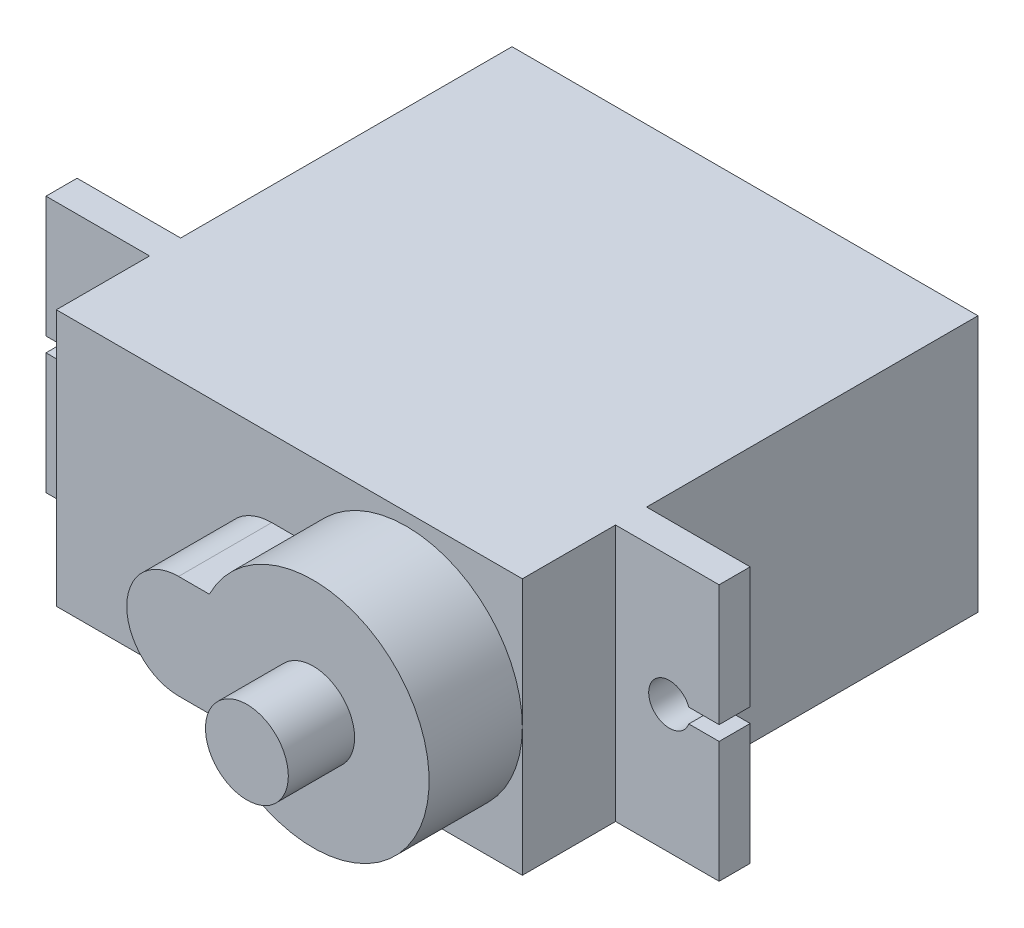
ISO-10303-21;
HEADER;
FILE_DESCRIPTION(('STEP AP214'),'2;1');
FILE_NAME('part.step','',(''),(''),'','','');
FILE_SCHEMA(('AUTOMOTIVE_DESIGN { 1 0 10303 214 1 1 1 1 }'));
ENDSEC;
DATA;
#1=APPLICATION_CONTEXT('core data for automotive mechanical design processes');
#2=APPLICATION_PROTOCOL_DEFINITION('international standard','automotive_design',2000,#1);
#3=PRODUCT_CONTEXT('',#1,'mechanical');
#4=PRODUCT('Part','Part','',(#3));
#5=PRODUCT_RELATED_PRODUCT_CATEGORY('part','',(#4));
#6=PRODUCT_DEFINITION_FORMATION('','',#4);
#7=PRODUCT_DEFINITION_CONTEXT('part definition',#1,'design');
#8=PRODUCT_DEFINITION('design','',#6,#7);
#9=PRODUCT_DEFINITION_SHAPE('','',#8);
#10=(LENGTH_UNIT() NAMED_UNIT(*) SI_UNIT(.MILLI.,.METRE.));
#11=(NAMED_UNIT(*) PLANE_ANGLE_UNIT() SI_UNIT($,.RADIAN.));
#12=(NAMED_UNIT(*) SI_UNIT($,.STERADIAN.) SOLID_ANGLE_UNIT());
#13=UNCERTAINTY_MEASURE_WITH_UNIT(LENGTH_MEASURE(1.E-05),#10,'distance_accuracy_value','');
#14=(GEOMETRIC_REPRESENTATION_CONTEXT(3) GLOBAL_UNCERTAINTY_ASSIGNED_CONTEXT((#13)) GLOBAL_UNIT_ASSIGNED_CONTEXT((#10,
#11,#12)) REPRESENTATION_CONTEXT('',''));
#15=CARTESIAN_POINT('',(0.,0.,0.));
#16=DIRECTION('',(0.,0.,1.));
#17=DIRECTION('',(1.,0.,0.));
#18=AXIS2_PLACEMENT_3D('',#15,#16,#17);
#19=CARTESIAN_POINT('',(-36.6554904609918,23.4734122395534,29.7));
#20=DIRECTION('',(0.,0.,1.));
#21=DIRECTION('',(1.,0.,0.));
#22=AXIS2_PLACEMENT_3D('',#19,#20,#21);
#23=PLANE('',#22);
#24=CARTESIAN_POINT('',(-34.9554904609918,23.4734122395534,29.7));
#25=DIRECTION('',(0.,0.,1.));
#26=DIRECTION('',(1.,0.,0.));
#27=AXIS2_PLACEMENT_3D('',#24,#25,#26);
#28=CIRCLE('',#27,2.);
#29=CARTESIAN_POINT('',(-32.9554904609918,23.4734122395534,29.7));
#30=VERTEX_POINT('',#29);
#31=EDGE_CURVE('E11',#30,#30,#28,.T.);
#32=ORIENTED_EDGE('',*,*,#31,.T.);
#33=EDGE_LOOP('',(#32));
#34=FACE_BOUND('',#33,.T.);
#35=ADVANCED_FACE('F17',(#34),#23,.T.);
#36=CARTESIAN_POINT('',(-34.9554904609918,23.4734122395534,29.7));
#37=DIRECTION('',(0.,0.,-1.));
#38=DIRECTION('',(-1.,0.,0.));
#39=AXIS2_PLACEMENT_3D('',#36,#37,#38);
#40=CYLINDRICAL_SURFACE('',#39,2.);
#41=CARTESIAN_POINT('',(-34.9554904609918,23.4734122395534,26.5));
#42=DIRECTION('',(0.,0.,1.));
#43=DIRECTION('',(1.,0.,0.));
#44=AXIS2_PLACEMENT_3D('',#41,#42,#43);
#45=CIRCLE('',#44,2.);
#46=CARTESIAN_POINT('',(-32.9554904609918,23.4734122395534,26.5));
#47=VERTEX_POINT('',#46);
#48=EDGE_CURVE('E28',#47,#47,#45,.T.);
#49=ORIENTED_EDGE('',*,*,#48,.T.);
#50=EDGE_LOOP('',(#49));
#51=FACE_BOUND('',#50,.T.);
#52=ORIENTED_EDGE('',*,*,#31,.F.);
#53=EDGE_LOOP('',(#52));
#54=FACE_BOUND('',#53,.T.);
#55=ADVANCED_FACE('F624',(#51,#54),#40,.T.);
#56=CARTESIAN_POINT('',(-40.6054904609918,23.4734122395534,26.5));
#57=DIRECTION('',(0.,0.,1.));
#58=DIRECTION('',(1.,0.,0.));
#59=AXIS2_PLACEMENT_3D('',#56,#57,#58);
#60=PLANE('',#59);
#61=DIRECTION('',(1.,0.,0.));
#62=VECTOR('',#61,1.);
#63=CARTESIAN_POINT('',(-40.7109844242653,25.9734122395534,26.5));
#64=LINE('',#63,#62);
#65=CARTESIAN_POINT('',(-41.4554904609919,25.9734122395534,26.5));
#66=VERTEX_POINT('',#65);
#67=CARTESIAN_POINT('',(-39.9664783875389,25.9734122395534,26.5));
#68=VERTEX_POINT('',#67);
#69=EDGE_CURVE('E455',#66,#68,#64,.T.);
#70=ORIENTED_EDGE('',*,*,#69,.F.);
#71=CARTESIAN_POINT('',(-41.4554904609919,23.4734122395534,26.5));
#72=DIRECTION('',(0.,0.,1.));
#73=DIRECTION('',(1.,0.,0.));
#74=AXIS2_PLACEMENT_3D('',#71,#72,#73);
#75=CIRCLE('',#74,2.5);
#76=CARTESIAN_POINT('',(-41.4554904609919,20.9734122395533,26.5));
#77=VERTEX_POINT('',#76);
#78=EDGE_CURVE('E144',#66,#77,#75,.T.);
#79=ORIENTED_EDGE('',*,*,#78,.T.);
#80=DIRECTION('',(1.,0.,0.));
#81=VECTOR('',#80,1.);
#82=CARTESIAN_POINT('',(-40.7109844242653,20.9734122395533,26.5));
#83=LINE('',#82,#81);
#84=CARTESIAN_POINT('',(-39.9664783875389,20.9734122395533,26.5));
#85=VERTEX_POINT('',#84);
#86=EDGE_CURVE('E331',#77,#85,#83,.T.);
#87=ORIENTED_EDGE('',*,*,#86,.T.);
#88=CARTESIAN_POINT('',(-34.9554904609918,23.4734122395534,26.5));
#89=DIRECTION('',(0.,0.,1.));
#90=DIRECTION('',(1.,0.,0.));
#91=AXIS2_PLACEMENT_3D('',#88,#89,#90);
#92=CIRCLE('',#91,5.6);
#93=EDGE_CURVE('E129',#85,#68,#92,.T.);
#94=ORIENTED_EDGE('',*,*,#93,.T.);
#95=EDGE_LOOP('',(#70,#79,#87,#94));
#96=FACE_BOUND('',#95,.T.);
#97=ORIENTED_EDGE('',*,*,#48,.F.);
#98=EDGE_LOOP('',(#97));
#99=FACE_BOUND('',#98,.T.);
#100=ADVANCED_FACE('F629',(#96,#99),#60,.T.);
#101=CARTESIAN_POINT('',(-34.9554904609918,23.4734122395534,26.5));
#102=DIRECTION('',(0.,0.,-1.));
#103=DIRECTION('',(-1.,0.,0.));
#104=AXIS2_PLACEMENT_3D('',#101,#102,#103);
#105=CYLINDRICAL_SURFACE('',#104,5.6);
#106=CARTESIAN_POINT('',(-34.9554904609918,23.4734122395534,22.));
#107=DIRECTION('',(0.,0.,1.));
#108=DIRECTION('',(1.,0.,0.));
#109=AXIS2_PLACEMENT_3D('',#106,#107,#108);
#110=CIRCLE('',#109,5.6);
#111=CARTESIAN_POINT('',(-39.9664783875389,20.9734122395533,22.));
#112=VERTEX_POINT('',#111);
#113=CARTESIAN_POINT('',(-29.3554904609919,23.4734122395534,22.));
#114=VERTEX_POINT('',#113);
#115=EDGE_CURVE('E75',#112,#114,#110,.T.);
#116=ORIENTED_EDGE('',*,*,#115,.T.);
#117=CARTESIAN_POINT('',(-34.9554904609918,23.4734122395534,22.));
#118=DIRECTION('',(0.,0.,1.));
#119=DIRECTION('',(1.,0.,0.));
#120=AXIS2_PLACEMENT_3D('',#117,#118,#119);
#121=CIRCLE('',#120,5.6);
#122=CARTESIAN_POINT('',(-39.9664783875389,25.9734122395534,22.));
#123=VERTEX_POINT('',#122);
#124=EDGE_CURVE('E342',#114,#123,#121,.T.);
#125=ORIENTED_EDGE('',*,*,#124,.T.);
#126=DIRECTION('',(0.,0.,-1.));
#127=VECTOR('',#126,1.);
#128=CARTESIAN_POINT('',(-39.9664783875389,25.9734122395534,26.5));
#129=LINE('',#128,#127);
#130=EDGE_CURVE('E88',#68,#123,#129,.T.);
#131=ORIENTED_EDGE('',*,*,#130,.F.);
#132=ORIENTED_EDGE('',*,*,#93,.F.);
#133=DIRECTION('',(0.,0.,-1.));
#134=VECTOR('',#133,1.);
#135=CARTESIAN_POINT('',(-39.9664783875389,20.9734122395533,26.5));
#136=LINE('',#135,#134);
#137=EDGE_CURVE('E334',#85,#112,#136,.T.);
#138=ORIENTED_EDGE('',*,*,#137,.T.);
#139=EDGE_LOOP('',(#116,#125,#131,#132,#138));
#140=FACE_BOUND('',#139,.T.);
#141=ADVANCED_FACE('F637',(#140),#105,.T.);
#142=CARTESIAN_POINT('',(-40.7109844242653,20.9734122395533,26.5));
#143=DIRECTION('',(0.,1.,0.));
#144=DIRECTION('',(1.,0.,0.));
#145=AXIS2_PLACEMENT_3D('',#142,#143,#144);
#146=PLANE('',#145);
#147=DIRECTION('',(1.,0.,0.));
#148=VECTOR('',#147,1.);
#149=CARTESIAN_POINT('',(-40.7109844242653,20.9734122395533,22.));
#150=LINE('',#149,#148);
#151=CARTESIAN_POINT('',(-41.4554904609919,20.9734122395533,22.));
#152=VERTEX_POINT('',#151);
#153=EDGE_CURVE('E414',#152,#112,#150,.T.);
#154=ORIENTED_EDGE('',*,*,#153,.T.);
#155=ORIENTED_EDGE('',*,*,#137,.F.);
#156=ORIENTED_EDGE('',*,*,#86,.F.);
#157=DIRECTION('',(0.,0.,-1.));
#158=VECTOR('',#157,1.);
#159=CARTESIAN_POINT('',(-41.4554904609919,20.9734122395533,26.5));
#160=LINE('',#159,#158);
#161=EDGE_CURVE('E288',#77,#152,#160,.T.);
#162=ORIENTED_EDGE('',*,*,#161,.T.);
#163=EDGE_LOOP('',(#154,#155,#156,#162));
#164=FACE_BOUND('',#163,.T.);
#165=ADVANCED_FACE('F19',(#164),#146,.F.);
#166=CARTESIAN_POINT('',(-41.4554904609919,23.4734122395534,26.5));
#167=DIRECTION('',(0.,0.,-1.));
#168=DIRECTION('',(-1.,0.,0.));
#169=AXIS2_PLACEMENT_3D('',#166,#167,#168);
#170=CYLINDRICAL_SURFACE('',#169,2.5);
#171=CARTESIAN_POINT('',(-41.4554904609919,23.4734122395534,22.));
#172=DIRECTION('',(0.,0.,1.));
#173=DIRECTION('',(1.,0.,0.));
#174=AXIS2_PLACEMENT_3D('',#171,#172,#173);
#175=CIRCLE('',#174,2.5);
#176=CARTESIAN_POINT('',(-41.4554904609919,25.9734122395534,22.));
#177=VERTEX_POINT('',#176);
#178=EDGE_CURVE('E295',#177,#152,#175,.T.);
#179=ORIENTED_EDGE('',*,*,#178,.T.);
#180=ORIENTED_EDGE('',*,*,#161,.F.);
#181=ORIENTED_EDGE('',*,*,#78,.F.);
#182=DIRECTION('',(0.,0.,-1.));
#183=VECTOR('',#182,1.);
#184=CARTESIAN_POINT('',(-41.4554904609919,25.9734122395534,26.5));
#185=LINE('',#184,#183);
#186=EDGE_CURVE('E286',#66,#177,#185,.T.);
#187=ORIENTED_EDGE('',*,*,#186,.T.);
#188=EDGE_LOOP('',(#179,#180,#181,#187));
#189=FACE_BOUND('',#188,.T.);
#190=ADVANCED_FACE('F470',(#189),#170,.T.);
#191=CARTESIAN_POINT('',(-40.7109844242653,25.9734122395534,26.5));
#192=DIRECTION('',(0.,1.,0.));
#193=DIRECTION('',(1.,0.,0.));
#194=AXIS2_PLACEMENT_3D('',#191,#192,#193);
#195=PLANE('',#194);
#196=DIRECTION('',(1.,0.,0.));
#197=VECTOR('',#196,1.);
#198=CARTESIAN_POINT('',(-40.7109844242653,25.9734122395534,22.));
#199=LINE('',#198,#197);
#200=EDGE_CURVE('E291',#177,#123,#199,.T.);
#201=ORIENTED_EDGE('',*,*,#200,.F.);
#202=ORIENTED_EDGE('',*,*,#186,.F.);
#203=ORIENTED_EDGE('',*,*,#69,.T.);
#204=ORIENTED_EDGE('',*,*,#130,.T.);
#205=EDGE_LOOP('',(#201,#202,#203,#204));
#206=FACE_BOUND('',#205,.T.);
#207=ADVANCED_FACE('F472',(#206),#195,.T.);
#208=CARTESIAN_POINT('',(-56.8554904609919,23.8234122395534,15.5));
#209=DIRECTION('',(0.,1.,0.));
#210=DIRECTION('',(1.,0.,0.));
#211=AXIS2_PLACEMENT_3D('',#208,#209,#210);
#212=PLANE('',#211);
#213=DIRECTION('',(0.,0.,1.));
#214=VECTOR('',#213,1.);
#215=CARTESIAN_POINT('',(-55.3922401607516,23.8234122395534,15.5));
#216=LINE('',#215,#214);
#217=CARTESIAN_POINT('',(-55.3922401607516,23.8234122395534,16.));
#218=VERTEX_POINT('',#217);
#219=CARTESIAN_POINT('',(-55.3922401607516,23.8234122395534,17.5));
#220=VERTEX_POINT('',#219);
#221=EDGE_CURVE('E261',#218,#220,#216,.T.);
#222=ORIENTED_EDGE('',*,*,#221,.T.);
#223=DIRECTION('',(-1.,0.,0.));
#224=VECTOR('',#223,1.);
#225=CARTESIAN_POINT('',(-56.8554904609919,23.8234122395534,17.5));
#226=LINE('',#225,#224);
#227=CARTESIAN_POINT('',(-56.8554904609919,23.8234122395534,17.5));
#228=VERTEX_POINT('',#227);
#229=EDGE_CURVE('E278',#220,#228,#226,.T.);
#230=ORIENTED_EDGE('',*,*,#229,.T.);
#231=DIRECTION('',(0.,0.,-1.));
#232=VECTOR('',#231,1.);
#233=CARTESIAN_POINT('',(-56.8554904609919,23.8234122395534,17.5));
#234=LINE('',#233,#232);
#235=CARTESIAN_POINT('',(-56.8554904609919,23.8234122395534,16.));
#236=VERTEX_POINT('',#235);
#237=EDGE_CURVE('E452',#228,#236,#234,.T.);
#238=ORIENTED_EDGE('',*,*,#237,.T.);
#239=DIRECTION('',(-1.,0.,0.));
#240=VECTOR('',#239,1.);
#241=CARTESIAN_POINT('',(-40.6054904609918,23.8234122395534,16.));
#242=LINE('',#241,#240);
#243=EDGE_CURVE('E458',#218,#236,#242,.T.);
#244=ORIENTED_EDGE('',*,*,#243,.F.);
#245=EDGE_LOOP('',(#222,#230,#238,#244));
#246=FACE_BOUND('',#245,.T.);
#247=ADVANCED_FACE('F611',(#246),#212,.F.);
#248=CARTESIAN_POINT('',(-56.8554904609919,23.1234122395534,15.5));
#249=DIRECTION('',(0.,1.,0.));
#250=DIRECTION('',(1.,0.,0.));
#251=AXIS2_PLACEMENT_3D('',#248,#249,#250);
#252=PLANE('',#251);
#253=DIRECTION('',(-1.,0.,0.));
#254=VECTOR('',#253,1.);
#255=CARTESIAN_POINT('',(-40.6054904609918,23.1234122395534,16.));
#256=LINE('',#255,#254);
#257=CARTESIAN_POINT('',(-55.3922401607516,23.1234122395533,16.));
#258=VERTEX_POINT('',#257);
#259=CARTESIAN_POINT('',(-56.8554904609919,23.1234122395534,16.));
#260=VERTEX_POINT('',#259);
#261=EDGE_CURVE('E432',#258,#260,#256,.T.);
#262=ORIENTED_EDGE('',*,*,#261,.T.);
#263=DIRECTION('',(0.,0.,-1.));
#264=VECTOR('',#263,1.);
#265=CARTESIAN_POINT('',(-56.8554904609919,23.1234122395534,17.5));
#266=LINE('',#265,#264);
#267=CARTESIAN_POINT('',(-56.8554904609919,23.1234122395534,17.5));
#268=VERTEX_POINT('',#267);
#269=EDGE_CURVE('E267',#268,#260,#266,.T.);
#270=ORIENTED_EDGE('',*,*,#269,.F.);
#271=DIRECTION('',(-1.,0.,0.));
#272=VECTOR('',#271,1.);
#273=CARTESIAN_POINT('',(-56.8554904609919,23.1234122395534,17.5));
#274=LINE('',#273,#272);
#275=CARTESIAN_POINT('',(-55.3922401607516,23.1234122395533,17.5));
#276=VERTEX_POINT('',#275);
#277=EDGE_CURVE('E265',#276,#268,#274,.T.);
#278=ORIENTED_EDGE('',*,*,#277,.F.);
#279=DIRECTION('',(0.,0.,1.));
#280=VECTOR('',#279,1.);
#281=CARTESIAN_POINT('',(-55.3922401607516,23.1234122395533,15.5));
#282=LINE('',#281,#280);
#283=EDGE_CURVE('E250',#258,#276,#282,.T.);
#284=ORIENTED_EDGE('',*,*,#283,.F.);
#285=EDGE_LOOP('',(#262,#270,#278,#284));
#286=FACE_BOUND('',#285,.T.);
#287=ADVANCED_FACE('F266',(#286),#252,.T.);
#288=CARTESIAN_POINT('',(-54.4554904609919,23.4734122395534,15.5));
#289=DIRECTION('',(0.,0.,1.));
#290=DIRECTION('',(1.,0.,0.));
#291=AXIS2_PLACEMENT_3D('',#288,#289,#290);
#292=CYLINDRICAL_SURFACE('',#291,1.);
#293=ORIENTED_EDGE('',*,*,#283,.T.);
#294=CARTESIAN_POINT('',(-54.4554904609919,23.4734122395534,17.5));
#295=DIRECTION('',(0.,0.,1.));
#296=DIRECTION('',(1.,0.,0.));
#297=AXIS2_PLACEMENT_3D('',#294,#295,#296);
#298=CIRCLE('',#297,1.);
#299=EDGE_CURVE('E254',#276,#220,#298,.T.);
#300=ORIENTED_EDGE('',*,*,#299,.T.);
#301=ORIENTED_EDGE('',*,*,#221,.F.);
#302=CARTESIAN_POINT('',(-54.4554904609919,23.4734122395534,16.));
#303=DIRECTION('',(0.,0.,1.));
#304=DIRECTION('',(1.,0.,0.));
#305=AXIS2_PLACEMENT_3D('',#302,#303,#304);
#306=CIRCLE('',#305,1.);
#307=EDGE_CURVE('E256',#258,#218,#306,.T.);
#308=ORIENTED_EDGE('',*,*,#307,.F.);
#309=EDGE_LOOP('',(#293,#300,#301,#308));
#310=FACE_BOUND('',#309,.T.);
#311=ADVANCED_FACE('F252',(#310),#292,.F.);
#312=CARTESIAN_POINT('',(-24.3554904609918,23.8234122395534,15.5));
#313=DIRECTION('',(0.,-1.,0.));
#314=DIRECTION('',(0.,0.,-1.));
#315=AXIS2_PLACEMENT_3D('',#312,#313,#314);
#316=PLANE('',#315);
#317=DIRECTION('',(0.,0.,1.));
#318=VECTOR('',#317,1.);
#319=CARTESIAN_POINT('',(-24.3554904609918,23.8234122395534,17.5));
#320=LINE('',#319,#318);
#321=CARTESIAN_POINT('',(-24.3554904609918,23.8234122395534,16.));
#322=VERTEX_POINT('',#321);
#323=CARTESIAN_POINT('',(-24.3554904609918,23.8234122395534,17.5));
#324=VERTEX_POINT('',#323);
#325=EDGE_CURVE('E315',#322,#324,#320,.T.);
#326=ORIENTED_EDGE('',*,*,#325,.T.);
#327=DIRECTION('',(1.,0.,0.));
#328=VECTOR('',#327,1.);
#329=CARTESIAN_POINT('',(-24.3554904609918,23.8234122395534,17.5));
#330=LINE('',#329,#328);
#331=CARTESIAN_POINT('',(-25.8187407612321,23.8234122395534,17.5));
#332=VERTEX_POINT('',#331);
#333=EDGE_CURVE('E220',#332,#324,#330,.T.);
#334=ORIENTED_EDGE('',*,*,#333,.F.);
#335=DIRECTION('',(0.,0.,1.));
#336=VECTOR('',#335,1.);
#337=CARTESIAN_POINT('',(-25.8187407612321,23.8234122395534,15.5));
#338=LINE('',#337,#336);
#339=CARTESIAN_POINT('',(-25.8187407612321,23.8234122395534,16.));
#340=VERTEX_POINT('',#339);
#341=EDGE_CURVE('E294',#340,#332,#338,.T.);
#342=ORIENTED_EDGE('',*,*,#341,.F.);
#343=DIRECTION('',(1.,0.,0.));
#344=VECTOR('',#343,1.);
#345=CARTESIAN_POINT('',(-40.6054904609918,23.8234122395534,16.));
#346=LINE('',#345,#344);
#347=EDGE_CURVE('E446',#340,#322,#346,.T.);
#348=ORIENTED_EDGE('',*,*,#347,.T.);
#349=EDGE_LOOP('',(#326,#334,#342,#348));
#350=FACE_BOUND('',#349,.T.);
#351=ADVANCED_FACE('F802',(#350),#316,.T.);
#352=CARTESIAN_POINT('',(-24.3554904609918,23.1234122395533,15.5));
#353=DIRECTION('',(0.,-1.,0.));
#354=DIRECTION('',(0.,0.,-1.));
#355=AXIS2_PLACEMENT_3D('',#352,#353,#354);
#356=PLANE('',#355);
#357=DIRECTION('',(1.,0.,0.));
#358=VECTOR('',#357,1.);
#359=CARTESIAN_POINT('',(-40.6054904609918,23.1234122395533,16.));
#360=LINE('',#359,#358);
#361=CARTESIAN_POINT('',(-25.8187407612321,23.1234122395534,16.));
#362=VERTEX_POINT('',#361);
#363=CARTESIAN_POINT('',(-24.3554904609918,23.1234122395533,16.));
#364=VERTEX_POINT('',#363);
#365=EDGE_CURVE('E398',#362,#364,#360,.T.);
#366=ORIENTED_EDGE('',*,*,#365,.F.);
#367=DIRECTION('',(0.,0.,1.));
#368=VECTOR('',#367,1.);
#369=CARTESIAN_POINT('',(-25.8187407612321,23.1234122395534,15.5));
#370=LINE('',#369,#368);
#371=CARTESIAN_POINT('',(-25.8187407612321,23.1234122395534,17.5));
#372=VERTEX_POINT('',#371);
#373=EDGE_CURVE('E262',#362,#372,#370,.T.);
#374=ORIENTED_EDGE('',*,*,#373,.T.);
#375=DIRECTION('',(1.,0.,0.));
#376=VECTOR('',#375,1.);
#377=CARTESIAN_POINT('',(-24.3554904609918,23.1234122395533,17.5));
#378=LINE('',#377,#376);
#379=CARTESIAN_POINT('',(-24.3554904609918,23.1234122395533,17.5));
#380=VERTEX_POINT('',#379);
#381=EDGE_CURVE('E300',#372,#380,#378,.T.);
#382=ORIENTED_EDGE('',*,*,#381,.T.);
#383=DIRECTION('',(0.,0.,1.));
#384=VECTOR('',#383,1.);
#385=CARTESIAN_POINT('',(-24.3554904609918,23.1234122395533,17.5));
#386=LINE('',#385,#384);
#387=EDGE_CURVE('E340',#364,#380,#386,.T.);
#388=ORIENTED_EDGE('',*,*,#387,.F.);
#389=EDGE_LOOP('',(#366,#374,#382,#388));
#390=FACE_BOUND('',#389,.T.);
#391=ADVANCED_FACE('F525',(#390),#356,.F.);
#392=CARTESIAN_POINT('',(-26.7554904609919,23.4734122395534,15.5));
#393=DIRECTION('',(0.,0.,1.));
#394=DIRECTION('',(1.,0.,0.));
#395=AXIS2_PLACEMENT_3D('',#392,#393,#394);
#396=CYLINDRICAL_SURFACE('',#395,1.);
#397=ORIENTED_EDGE('',*,*,#341,.T.);
#398=CARTESIAN_POINT('',(-26.7554904609919,23.4734122395534,17.5));
#399=DIRECTION('',(0.,0.,1.));
#400=DIRECTION('',(1.,0.,0.));
#401=AXIS2_PLACEMENT_3D('',#398,#399,#400);
#402=CIRCLE('',#401,1.);
#403=EDGE_CURVE('E296',#332,#372,#402,.T.);
#404=ORIENTED_EDGE('',*,*,#403,.T.);
#405=ORIENTED_EDGE('',*,*,#373,.F.);
#406=CARTESIAN_POINT('',(-26.7554904609919,23.4734122395534,16.));
#407=DIRECTION('',(0.,0.,1.));
#408=DIRECTION('',(1.,0.,0.));
#409=AXIS2_PLACEMENT_3D('',#406,#407,#408);
#410=CIRCLE('',#409,1.);
#411=EDGE_CURVE('E395',#340,#362,#410,.T.);
#412=ORIENTED_EDGE('',*,*,#411,.F.);
#413=EDGE_LOOP('',(#397,#404,#405,#412));
#414=FACE_BOUND('',#413,.T.);
#415=ADVANCED_FACE('F518',(#414),#396,.F.);
#416=CARTESIAN_POINT('',(-40.6054904609919,23.4734122395534,22.));
#417=DIRECTION('',(0.,0.,1.));
#418=DIRECTION('',(1.,0.,0.));
#419=AXIS2_PLACEMENT_3D('',#416,#417,#418);
#420=PLANE('',#419);
#421=ORIENTED_EDGE('',*,*,#124,.F.);
#422=DIRECTION('',(0.,1.,0.));
#423=VECTOR('',#422,1.);
#424=CARTESIAN_POINT('',(-29.3554904609919,23.4734122395534,22.));
#425=LINE('',#424,#423);
#426=CARTESIAN_POINT('',(-29.3554904609919,29.6734122395533,22.));
#427=VERTEX_POINT('',#426);
#428=EDGE_CURVE('E487',#114,#427,#425,.T.);
#429=ORIENTED_EDGE('',*,*,#428,.T.);
#430=DIRECTION('',(-1.,0.,0.));
#431=VECTOR('',#430,1.);
#432=CARTESIAN_POINT('',(-40.6054904609918,29.6734122395533,22.));
#433=LINE('',#432,#431);
#434=CARTESIAN_POINT('',(-51.8554904609919,29.6734122395533,22.));
#435=VERTEX_POINT('',#434);
#436=EDGE_CURVE('E306',#427,#435,#433,.T.);
#437=ORIENTED_EDGE('',*,*,#436,.T.);
#438=DIRECTION('',(0.,1.,0.));
#439=VECTOR('',#438,1.);
#440=CARTESIAN_POINT('',(-51.8554904609919,23.4734122395534,22.));
#441=LINE('',#440,#439);
#442=CARTESIAN_POINT('',(-51.8554904609919,17.2734122395534,22.));
#443=VERTEX_POINT('',#442);
#444=EDGE_CURVE('E345',#443,#435,#441,.T.);
#445=ORIENTED_EDGE('',*,*,#444,.F.);
#446=DIRECTION('',(-1.,0.,0.));
#447=VECTOR('',#446,1.);
#448=CARTESIAN_POINT('',(-40.6054904609918,17.2734122395534,22.));
#449=LINE('',#448,#447);
#450=CARTESIAN_POINT('',(-29.3554904609919,17.2734122395534,22.));
#451=VERTEX_POINT('',#450);
#452=EDGE_CURVE('E367',#451,#443,#449,.T.);
#453=ORIENTED_EDGE('',*,*,#452,.F.);
#454=DIRECTION('',(0.,1.,0.));
#455=VECTOR('',#454,1.);
#456=CARTESIAN_POINT('',(-29.3554904609919,23.4734122395534,22.));
#457=LINE('',#456,#455);
#458=EDGE_CURVE('E478',#451,#114,#457,.T.);
#459=ORIENTED_EDGE('',*,*,#458,.T.);
#460=ORIENTED_EDGE('',*,*,#115,.F.);
#461=ORIENTED_EDGE('',*,*,#153,.F.);
#462=ORIENTED_EDGE('',*,*,#178,.F.);
#463=ORIENTED_EDGE('',*,*,#200,.T.);
#464=EDGE_LOOP('',(#421,#429,#437,#445,#453,#459,#460,#461,#462,#463));
#465=FACE_BOUND('',#464,.T.);
#466=ADVANCED_FACE('F474',(#465),#420,.T.);
#467=CARTESIAN_POINT('',(-51.8554904609919,23.4734122395534,22.));
#468=DIRECTION('',(-1.,0.,0.));
#469=DIRECTION('',(0.,0.,1.));
#470=AXIS2_PLACEMENT_3D('',#467,#468,#469);
#471=PLANE('',#470);
#472=DIRECTION('',(0.,1.,0.));
#473=VECTOR('',#472,1.);
#474=CARTESIAN_POINT('',(-51.8554904609919,23.4734122395534,17.5));
#475=LINE('',#474,#473);
#476=CARTESIAN_POINT('',(-51.8554904609919,17.2734122395534,17.5));
#477=VERTEX_POINT('',#476);
#478=CARTESIAN_POINT('',(-51.8554904609919,29.6734122395533,17.5));
#479=VERTEX_POINT('',#478);
#480=EDGE_CURVE('E309',#477,#479,#475,.T.);
#481=ORIENTED_EDGE('',*,*,#480,.F.);
#482=DIRECTION('',(0.,0.,-1.));
#483=VECTOR('',#482,1.);
#484=CARTESIAN_POINT('',(-51.8554904609919,17.2734122395534,22.));
#485=LINE('',#484,#483);
#486=EDGE_CURVE('E330',#443,#477,#485,.T.);
#487=ORIENTED_EDGE('',*,*,#486,.F.);
#488=ORIENTED_EDGE('',*,*,#444,.T.);
#489=DIRECTION('',(0.,0.,-1.));
#490=VECTOR('',#489,1.);
#491=CARTESIAN_POINT('',(-51.8554904609919,29.6734122395533,22.));
#492=LINE('',#491,#490);
#493=EDGE_CURVE('E440',#435,#479,#492,.T.);
#494=ORIENTED_EDGE('',*,*,#493,.T.);
#495=EDGE_LOOP('',(#481,#487,#488,#494));
#496=FACE_BOUND('',#495,.T.);
#497=ADVANCED_FACE('F606',(#496),#471,.T.);
#498=CARTESIAN_POINT('',(-29.3554904609919,23.4734122395534,22.));
#499=DIRECTION('',(-1.,0.,0.));
#500=DIRECTION('',(0.,0.,1.));
#501=AXIS2_PLACEMENT_3D('',#498,#499,#500);
#502=PLANE('',#501);
#503=DIRECTION('',(0.,1.,0.));
#504=VECTOR('',#503,1.);
#505=CARTESIAN_POINT('',(-29.3554904609919,23.4734122395534,17.5));
#506=LINE('',#505,#504);
#507=CARTESIAN_POINT('',(-29.3554904609919,17.2734122395534,17.5));
#508=VERTEX_POINT('',#507);
#509=CARTESIAN_POINT('',(-29.3554904609919,29.6734122395533,17.5));
#510=VERTEX_POINT('',#509);
#511=EDGE_CURVE('E399',#508,#510,#506,.T.);
#512=ORIENTED_EDGE('',*,*,#511,.T.);
#513=DIRECTION('',(0.,0.,-1.));
#514=VECTOR('',#513,1.);
#515=CARTESIAN_POINT('',(-29.3554904609919,29.6734122395533,22.));
#516=LINE('',#515,#514);
#517=EDGE_CURVE('E301',#427,#510,#516,.T.);
#518=ORIENTED_EDGE('',*,*,#517,.F.);
#519=ORIENTED_EDGE('',*,*,#428,.F.);
#520=ORIENTED_EDGE('',*,*,#458,.F.);
#521=DIRECTION('',(0.,0.,-1.));
#522=VECTOR('',#521,1.);
#523=CARTESIAN_POINT('',(-29.3554904609919,17.2734122395534,22.));
#524=LINE('',#523,#522);
#525=EDGE_CURVE('E374',#451,#508,#524,.T.);
#526=ORIENTED_EDGE('',*,*,#525,.T.);
#527=EDGE_LOOP('',(#512,#518,#519,#520,#526));
#528=FACE_BOUND('',#527,.T.);
#529=ADVANCED_FACE('F491',(#528),#502,.F.);
#530=CARTESIAN_POINT('',(-40.6054904609918,23.4734122395534,16.));
#531=DIRECTION('',(0.,0.,1.));
#532=DIRECTION('',(1.,0.,0.));
#533=AXIS2_PLACEMENT_3D('',#530,#531,#532);
#534=PLANE('',#533);
#535=ORIENTED_EDGE('',*,*,#411,.T.);
#536=ORIENTED_EDGE('',*,*,#365,.T.);
#537=DIRECTION('',(0.,1.,0.));
#538=VECTOR('',#537,1.);
#539=CARTESIAN_POINT('',(-24.3554904609918,23.4734122395534,16.));
#540=LINE('',#539,#538);
#541=CARTESIAN_POINT('',(-24.3554904609918,17.2734122395534,16.));
#542=VERTEX_POINT('',#541);
#543=EDGE_CURVE('E337',#542,#364,#540,.T.);
#544=ORIENTED_EDGE('',*,*,#543,.F.);
#545=DIRECTION('',(-1.,0.,0.));
#546=VECTOR('',#545,1.);
#547=CARTESIAN_POINT('',(-40.6054904609918,17.2734122395534,16.));
#548=LINE('',#547,#546);
#549=CARTESIAN_POINT('',(-29.3554904609919,17.2734122395534,16.));
#550=VERTEX_POINT('',#549);
#551=EDGE_CURVE('E390',#542,#550,#548,.T.);
#552=ORIENTED_EDGE('',*,*,#551,.T.);
#553=DIRECTION('',(0.,-1.,0.));
#554=VECTOR('',#553,1.);
#555=CARTESIAN_POINT('',(-29.3554904609919,23.4734122395534,16.));
#556=LINE('',#555,#554);
#557=CARTESIAN_POINT('',(-29.3554904609919,29.6734122395533,16.));
#558=VERTEX_POINT('',#557);
#559=EDGE_CURVE('E329',#558,#550,#556,.T.);
#560=ORIENTED_EDGE('',*,*,#559,.F.);
#561=DIRECTION('',(-1.,0.,0.));
#562=VECTOR('',#561,1.);
#563=CARTESIAN_POINT('',(-40.6054904609918,29.6734122395533,16.));
#564=LINE('',#563,#562);
#565=CARTESIAN_POINT('',(-24.3554904609918,29.6734122395534,16.));
#566=VERTEX_POINT('',#565);
#567=EDGE_CURVE('E232',#566,#558,#564,.T.);
#568=ORIENTED_EDGE('',*,*,#567,.F.);
#569=DIRECTION('',(0.,1.,0.));
#570=VECTOR('',#569,1.);
#571=CARTESIAN_POINT('',(-24.3554904609918,23.4734122395534,16.));
#572=LINE('',#571,#570);
#573=EDGE_CURVE('E319',#322,#566,#572,.T.);
#574=ORIENTED_EDGE('',*,*,#573,.F.);
#575=ORIENTED_EDGE('',*,*,#347,.F.);
#576=EDGE_LOOP('',(#535,#536,#544,#552,#560,#568,#574,#575));
#577=FACE_BOUND('',#576,.T.);
#578=ADVANCED_FACE('F513',(#577),#534,.F.);
#579=CARTESIAN_POINT('',(-40.6054904609918,23.4734122395534,17.5));
#580=DIRECTION('',(0.,0.,1.));
#581=DIRECTION('',(1.,0.,0.));
#582=AXIS2_PLACEMENT_3D('',#579,#580,#581);
#583=PLANE('',#582);
#584=ORIENTED_EDGE('',*,*,#381,.F.);
#585=ORIENTED_EDGE('',*,*,#403,.F.);
#586=ORIENTED_EDGE('',*,*,#333,.T.);
#587=DIRECTION('',(0.,1.,0.));
#588=VECTOR('',#587,1.);
#589=CARTESIAN_POINT('',(-24.3554904609918,23.4734122395534,17.5));
#590=LINE('',#589,#588);
#591=CARTESIAN_POINT('',(-24.3554904609918,29.6734122395534,17.5));
#592=VERTEX_POINT('',#591);
#593=EDGE_CURVE('E324',#324,#592,#590,.T.);
#594=ORIENTED_EDGE('',*,*,#593,.T.);
#595=DIRECTION('',(-1.,0.,0.));
#596=VECTOR('',#595,1.);
#597=CARTESIAN_POINT('',(-40.6054904609918,29.6734122395533,17.5));
#598=LINE('',#597,#596);
#599=EDGE_CURVE('E305',#592,#510,#598,.T.);
#600=ORIENTED_EDGE('',*,*,#599,.T.);
#601=ORIENTED_EDGE('',*,*,#511,.F.);
#602=DIRECTION('',(-1.,0.,0.));
#603=VECTOR('',#602,1.);
#604=CARTESIAN_POINT('',(-40.6054904609918,17.2734122395534,17.5));
#605=LINE('',#604,#603);
#606=CARTESIAN_POINT('',(-24.3554904609918,17.2734122395534,17.5));
#607=VERTEX_POINT('',#606);
#608=EDGE_CURVE('E370',#607,#508,#605,.T.);
#609=ORIENTED_EDGE('',*,*,#608,.F.);
#610=DIRECTION('',(0.,1.,0.));
#611=VECTOR('',#610,1.);
#612=CARTESIAN_POINT('',(-24.3554904609918,23.4734122395534,17.5));
#613=LINE('',#612,#611);
#614=EDGE_CURVE('E580',#607,#380,#613,.T.);
#615=ORIENTED_EDGE('',*,*,#614,.T.);
#616=EDGE_LOOP('',(#584,#585,#586,#594,#600,#601,#609,#615));
#617=FACE_BOUND('',#616,.T.);
#618=ADVANCED_FACE('F546',(#617),#583,.T.);
#619=CARTESIAN_POINT('',(-56.8554904609919,23.4734122395534,17.5));
#620=DIRECTION('',(-1.,0.,0.));
#621=DIRECTION('',(0.,0.,1.));
#622=AXIS2_PLACEMENT_3D('',#619,#620,#621);
#623=PLANE('',#622);
#624=ORIENTED_EDGE('',*,*,#237,.F.);
#625=DIRECTION('',(0.,1.,0.));
#626=VECTOR('',#625,1.);
#627=CARTESIAN_POINT('',(-56.8554904609919,23.4734122395534,17.5));
#628=LINE('',#627,#626);
#629=CARTESIAN_POINT('',(-56.8554904609919,29.6734122395534,17.5));
#630=VERTEX_POINT('',#629);
#631=EDGE_CURVE('E355',#228,#630,#628,.T.);
#632=ORIENTED_EDGE('',*,*,#631,.T.);
#633=DIRECTION('',(0.,0.,-1.));
#634=VECTOR('',#633,1.);
#635=CARTESIAN_POINT('',(-56.8554904609919,29.6734122395534,17.5));
#636=LINE('',#635,#634);
#637=CARTESIAN_POINT('',(-56.8554904609919,29.6734122395534,16.));
#638=VERTEX_POINT('',#637);
#639=EDGE_CURVE('E388',#630,#638,#636,.T.);
#640=ORIENTED_EDGE('',*,*,#639,.T.);
#641=DIRECTION('',(0.,1.,0.));
#642=VECTOR('',#641,1.);
#643=CARTESIAN_POINT('',(-56.8554904609919,23.4734122395534,16.));
#644=LINE('',#643,#642);
#645=EDGE_CURVE('E383',#236,#638,#644,.T.);
#646=ORIENTED_EDGE('',*,*,#645,.F.);
#647=EDGE_LOOP('',(#624,#632,#640,#646));
#648=FACE_BOUND('',#647,.T.);
#649=ADVANCED_FACE('F609',(#648),#623,.T.);
#650=CARTESIAN_POINT('',(-24.3554904609918,23.4734122395534,17.5));
#651=DIRECTION('',(-1.,0.,0.));
#652=DIRECTION('',(0.,0.,1.));
#653=AXIS2_PLACEMENT_3D('',#650,#651,#652);
#654=PLANE('',#653);
#655=ORIENTED_EDGE('',*,*,#543,.T.);
#656=ORIENTED_EDGE('',*,*,#387,.T.);
#657=ORIENTED_EDGE('',*,*,#614,.F.);
#658=DIRECTION('',(0.,0.,-1.));
#659=VECTOR('',#658,1.);
#660=CARTESIAN_POINT('',(-24.3554904609918,17.2734122395534,17.5));
#661=LINE('',#660,#659);
#662=EDGE_CURVE('E375',#607,#542,#661,.T.);
#663=ORIENTED_EDGE('',*,*,#662,.T.);
#664=EDGE_LOOP('',(#655,#656,#657,#663));
#665=FACE_BOUND('',#664,.T.);
#666=ADVANCED_FACE('F652',(#665),#654,.F.);
#667=CARTESIAN_POINT('',(-40.6054904609918,23.4734122395534,0.));
#668=DIRECTION('',(0.,0.,1.));
#669=DIRECTION('',(1.,0.,0.));
#670=AXIS2_PLACEMENT_3D('',#667,#668,#669);
#671=PLANE('',#670);
#672=DIRECTION('',(1.,0.,0.));
#673=VECTOR('',#672,1.);
#674=CARTESIAN_POINT('',(-40.6054904609918,29.6734122395533,0.));
#675=LINE('',#674,#673);
#676=CARTESIAN_POINT('',(-51.8554904609919,29.6734122395533,0.));
#677=VERTEX_POINT('',#676);
#678=CARTESIAN_POINT('',(-29.3554904609919,29.6734122395533,0.));
#679=VERTEX_POINT('',#678);
#680=EDGE_CURVE('E389',#677,#679,#675,.T.);
#681=ORIENTED_EDGE('',*,*,#680,.T.);
#682=DIRECTION('',(0.,-1.,0.));
#683=VECTOR('',#682,1.);
#684=CARTESIAN_POINT('',(-29.3554904609919,23.4734122395534,0.));
#685=LINE('',#684,#683);
#686=CARTESIAN_POINT('',(-29.3554904609919,17.2734122395534,0.));
#687=VERTEX_POINT('',#686);
#688=EDGE_CURVE('E325',#679,#687,#685,.T.);
#689=ORIENTED_EDGE('',*,*,#688,.T.);
#690=DIRECTION('',(1.,0.,0.));
#691=VECTOR('',#690,1.);
#692=CARTESIAN_POINT('',(-40.6054904609918,17.2734122395534,0.));
#693=LINE('',#692,#691);
#694=CARTESIAN_POINT('',(-51.8554904609919,17.2734122395534,0.));
#695=VERTEX_POINT('',#694);
#696=EDGE_CURVE('E362',#695,#687,#693,.T.);
#697=ORIENTED_EDGE('',*,*,#696,.F.);
#698=DIRECTION('',(0.,-1.,0.));
#699=VECTOR('',#698,1.);
#700=CARTESIAN_POINT('',(-51.8554904609919,23.4734122395534,0.));
#701=LINE('',#700,#699);
#702=EDGE_CURVE('E350',#677,#695,#701,.T.);
#703=ORIENTED_EDGE('',*,*,#702,.F.);
#704=EDGE_LOOP('',(#681,#689,#697,#703));
#705=FACE_BOUND('',#704,.T.);
#706=ADVANCED_FACE('F646',(#705),#671,.F.);
#707=CARTESIAN_POINT('',(-29.3554904609919,23.4734122395534,16.));
#708=DIRECTION('',(1.,0.,0.));
#709=DIRECTION('',(0.,1.,0.));
#710=AXIS2_PLACEMENT_3D('',#707,#708,#709);
#711=PLANE('',#710);
#712=ORIENTED_EDGE('',*,*,#688,.F.);
#713=DIRECTION('',(0.,0.,-1.));
#714=VECTOR('',#713,1.);
#715=CARTESIAN_POINT('',(-29.3554904609919,29.6734122395533,16.));
#716=LINE('',#715,#714);
#717=EDGE_CURVE('E21',#558,#679,#716,.T.);
#718=ORIENTED_EDGE('',*,*,#717,.F.);
#719=ORIENTED_EDGE('',*,*,#559,.T.);
#720=DIRECTION('',(0.,0.,-1.));
#721=VECTOR('',#720,1.);
#722=CARTESIAN_POINT('',(-29.3554904609919,17.2734122395534,16.));
#723=LINE('',#722,#721);
#724=EDGE_CURVE('E394',#550,#687,#723,.T.);
#725=ORIENTED_EDGE('',*,*,#724,.T.);
#726=EDGE_LOOP('',(#712,#718,#719,#725));
#727=FACE_BOUND('',#726,.T.);
#728=ADVANCED_FACE('F644',(#727),#711,.T.);
#729=CARTESIAN_POINT('',(-40.6054904609918,17.2734122395534,16.));
#730=DIRECTION('',(0.,1.,0.));
#731=DIRECTION('',(1.,0.,0.));
#732=AXIS2_PLACEMENT_3D('',#729,#730,#731);
#733=PLANE('',#732);
#734=ORIENTED_EDGE('',*,*,#696,.T.);
#735=ORIENTED_EDGE('',*,*,#724,.F.);
#736=ORIENTED_EDGE('',*,*,#551,.F.);
#737=ORIENTED_EDGE('',*,*,#662,.F.);
#738=ORIENTED_EDGE('',*,*,#608,.T.);
#739=ORIENTED_EDGE('',*,*,#525,.F.);
#740=ORIENTED_EDGE('',*,*,#452,.T.);
#741=ORIENTED_EDGE('',*,*,#486,.T.);
#742=DIRECTION('',(-1.,0.,0.));
#743=VECTOR('',#742,1.);
#744=CARTESIAN_POINT('',(-40.6054904609918,17.2734122395534,17.5));
#745=LINE('',#744,#743);
#746=CARTESIAN_POINT('',(-56.8554904609919,17.2734122395534,17.5));
#747=VERTEX_POINT('',#746);
#748=EDGE_CURVE('E314',#477,#747,#745,.T.);
#749=ORIENTED_EDGE('',*,*,#748,.T.);
#750=DIRECTION('',(0.,0.,-1.));
#751=VECTOR('',#750,1.);
#752=CARTESIAN_POINT('',(-56.8554904609919,17.2734122395534,17.5));
#753=LINE('',#752,#751);
#754=CARTESIAN_POINT('',(-56.8554904609919,17.2734122395534,16.));
#755=VERTEX_POINT('',#754);
#756=EDGE_CURVE('E437',#747,#755,#753,.T.);
#757=ORIENTED_EDGE('',*,*,#756,.T.);
#758=DIRECTION('',(-1.,0.,0.));
#759=VECTOR('',#758,1.);
#760=CARTESIAN_POINT('',(-40.6054904609918,17.2734122395534,16.));
#761=LINE('',#760,#759);
#762=CARTESIAN_POINT('',(-51.8554904609919,17.2734122395534,16.));
#763=VERTEX_POINT('',#762);
#764=EDGE_CURVE('E349',#763,#755,#761,.T.);
#765=ORIENTED_EDGE('',*,*,#764,.F.);
#766=DIRECTION('',(0.,0.,-1.));
#767=VECTOR('',#766,1.);
#768=CARTESIAN_POINT('',(-51.8554904609919,17.2734122395534,16.));
#769=LINE('',#768,#767);
#770=EDGE_CURVE('E354',#763,#695,#769,.T.);
#771=ORIENTED_EDGE('',*,*,#770,.T.);
#772=EDGE_LOOP('',(#734,#735,#736,#737,#738,#739,#740,#741,#749,#757,#765,#771));
#773=FACE_BOUND('',#772,.T.);
#774=ADVANCED_FACE('F602',(#773),#733,.F.);
#775=CARTESIAN_POINT('',(-51.8554904609919,23.4734122395534,16.));
#776=DIRECTION('',(1.,0.,0.));
#777=DIRECTION('',(0.,1.,0.));
#778=AXIS2_PLACEMENT_3D('',#775,#776,#777);
#779=PLANE('',#778);
#780=ORIENTED_EDGE('',*,*,#702,.T.);
#781=ORIENTED_EDGE('',*,*,#770,.F.);
#782=DIRECTION('',(0.,-1.,0.));
#783=VECTOR('',#782,1.);
#784=CARTESIAN_POINT('',(-51.8554904609919,23.4734122395534,16.));
#785=LINE('',#784,#783);
#786=CARTESIAN_POINT('',(-51.8554904609919,29.6734122395533,16.));
#787=VERTEX_POINT('',#786);
#788=EDGE_CURVE('E382',#787,#763,#785,.T.);
#789=ORIENTED_EDGE('',*,*,#788,.F.);
#790=DIRECTION('',(0.,0.,-1.));
#791=VECTOR('',#790,1.);
#792=CARTESIAN_POINT('',(-51.8554904609919,29.6734122395533,16.));
#793=LINE('',#792,#791);
#794=EDGE_CURVE('E384',#787,#677,#793,.T.);
#795=ORIENTED_EDGE('',*,*,#794,.T.);
#796=EDGE_LOOP('',(#780,#781,#789,#795));
#797=FACE_BOUND('',#796,.T.);
#798=ADVANCED_FACE('F634',(#797),#779,.F.);
#799=CARTESIAN_POINT('',(-40.6054904609918,29.6734122395533,16.));
#800=DIRECTION('',(0.,1.,0.));
#801=DIRECTION('',(1.,0.,0.));
#802=AXIS2_PLACEMENT_3D('',#799,#800,#801);
#803=PLANE('',#802);
#804=ORIENTED_EDGE('',*,*,#680,.F.);
#805=ORIENTED_EDGE('',*,*,#794,.F.);
#806=DIRECTION('',(-1.,0.,0.));
#807=VECTOR('',#806,1.);
#808=CARTESIAN_POINT('',(-40.6054904609918,29.6734122395533,16.));
#809=LINE('',#808,#807);
#810=EDGE_CURVE('E378',#787,#638,#809,.T.);
#811=ORIENTED_EDGE('',*,*,#810,.T.);
#812=ORIENTED_EDGE('',*,*,#639,.F.);
#813=DIRECTION('',(-1.,0.,0.));
#814=VECTOR('',#813,1.);
#815=CARTESIAN_POINT('',(-40.6054904609918,29.6734122395533,17.5));
#816=LINE('',#815,#814);
#817=EDGE_CURVE('E313',#479,#630,#816,.T.);
#818=ORIENTED_EDGE('',*,*,#817,.F.);
#819=ORIENTED_EDGE('',*,*,#493,.F.);
#820=ORIENTED_EDGE('',*,*,#436,.F.);
#821=ORIENTED_EDGE('',*,*,#517,.T.);
#822=ORIENTED_EDGE('',*,*,#599,.F.);
#823=DIRECTION('',(0.,0.,-1.));
#824=VECTOR('',#823,1.);
#825=CARTESIAN_POINT('',(-24.3554904609918,29.6734122395534,17.5));
#826=LINE('',#825,#824);
#827=EDGE_CURVE('E321',#592,#566,#826,.T.);
#828=ORIENTED_EDGE('',*,*,#827,.T.);
#829=ORIENTED_EDGE('',*,*,#567,.T.);
#830=ORIENTED_EDGE('',*,*,#717,.T.);
#831=EDGE_LOOP('',(#804,#805,#811,#812,#818,#819,#820,#821,#822,#828,#829,#830));
#832=FACE_BOUND('',#831,.T.);
#833=ADVANCED_FACE('F551',(#832),#803,.T.);
#834=CARTESIAN_POINT('',(-56.8554904609919,23.4734122395534,17.5));
#835=DIRECTION('',(-1.,0.,0.));
#836=DIRECTION('',(0.,0.,1.));
#837=AXIS2_PLACEMENT_3D('',#834,#835,#836);
#838=PLANE('',#837);
#839=DIRECTION('',(0.,1.,0.));
#840=VECTOR('',#839,1.);
#841=CARTESIAN_POINT('',(-56.8554904609919,23.4734122395534,17.5));
#842=LINE('',#841,#840);
#843=EDGE_CURVE('E272',#747,#268,#842,.T.);
#844=ORIENTED_EDGE('',*,*,#843,.T.);
#845=ORIENTED_EDGE('',*,*,#269,.T.);
#846=DIRECTION('',(0.,1.,0.));
#847=VECTOR('',#846,1.);
#848=CARTESIAN_POINT('',(-56.8554904609919,23.4734122395534,16.));
#849=LINE('',#848,#847);
#850=EDGE_CURVE('E320',#755,#260,#849,.T.);
#851=ORIENTED_EDGE('',*,*,#850,.F.);
#852=ORIENTED_EDGE('',*,*,#756,.F.);
#853=EDGE_LOOP('',(#844,#845,#851,#852));
#854=FACE_BOUND('',#853,.T.);
#855=ADVANCED_FACE('F598',(#854),#838,.T.);
#856=CARTESIAN_POINT('',(-24.3554904609918,23.4734122395534,17.5));
#857=DIRECTION('',(-1.,0.,0.));
#858=DIRECTION('',(0.,0.,1.));
#859=AXIS2_PLACEMENT_3D('',#856,#857,#858);
#860=PLANE('',#859);
#861=ORIENTED_EDGE('',*,*,#325,.F.);
#862=ORIENTED_EDGE('',*,*,#573,.T.);
#863=ORIENTED_EDGE('',*,*,#827,.F.);
#864=ORIENTED_EDGE('',*,*,#593,.F.);
#865=EDGE_LOOP('',(#861,#862,#863,#864));
#866=FACE_BOUND('',#865,.T.);
#867=ADVANCED_FACE('F511',(#866),#860,.F.);
#868=CARTESIAN_POINT('',(-40.6054904609918,23.4734122395534,16.));
#869=DIRECTION('',(0.,0.,1.));
#870=DIRECTION('',(1.,0.,0.));
#871=AXIS2_PLACEMENT_3D('',#868,#869,#870);
#872=PLANE('',#871);
#873=ORIENTED_EDGE('',*,*,#261,.F.);
#874=ORIENTED_EDGE('',*,*,#307,.T.);
#875=ORIENTED_EDGE('',*,*,#243,.T.);
#876=ORIENTED_EDGE('',*,*,#645,.T.);
#877=ORIENTED_EDGE('',*,*,#810,.F.);
#878=ORIENTED_EDGE('',*,*,#788,.T.);
#879=ORIENTED_EDGE('',*,*,#764,.T.);
#880=ORIENTED_EDGE('',*,*,#850,.T.);
#881=EDGE_LOOP('',(#873,#874,#875,#876,#877,#878,#879,#880));
#882=FACE_BOUND('',#881,.T.);
#883=ADVANCED_FACE('F643',(#882),#872,.F.);
#884=CARTESIAN_POINT('',(-40.6054904609918,23.4734122395534,17.5));
#885=DIRECTION('',(0.,0.,1.));
#886=DIRECTION('',(1.,0.,0.));
#887=AXIS2_PLACEMENT_3D('',#884,#885,#886);
#888=PLANE('',#887);
#889=ORIENTED_EDGE('',*,*,#299,.F.);
#890=ORIENTED_EDGE('',*,*,#277,.T.);
#891=ORIENTED_EDGE('',*,*,#843,.F.);
#892=ORIENTED_EDGE('',*,*,#748,.F.);
#893=ORIENTED_EDGE('',*,*,#480,.T.);
#894=ORIENTED_EDGE('',*,*,#817,.T.);
#895=ORIENTED_EDGE('',*,*,#631,.F.);
#896=ORIENTED_EDGE('',*,*,#229,.F.);
#897=EDGE_LOOP('',(#889,#890,#891,#892,#893,#894,#895,#896));
#898=FACE_BOUND('',#897,.T.);
#899=ADVANCED_FACE('F275',(#898),#888,.T.);
#900=CLOSED_SHELL('',(#35,#55,#100,#141,#165,#190,#207,#247,#287,#311,#351,#391,#415,#466,#497,
#529,#578,#618,#649,#666,#706,#728,#774,#798,#833,#855,#867,#883,#899));
#901=MANIFOLD_SOLID_BREP('B1',#900);
#902=ADVANCED_BREP_SHAPE_REPRESENTATION('',(#18,#901),#14);
#903=SHAPE_DEFINITION_REPRESENTATION(#9,#902);
ENDSEC;
END-ISO-10303-21;
